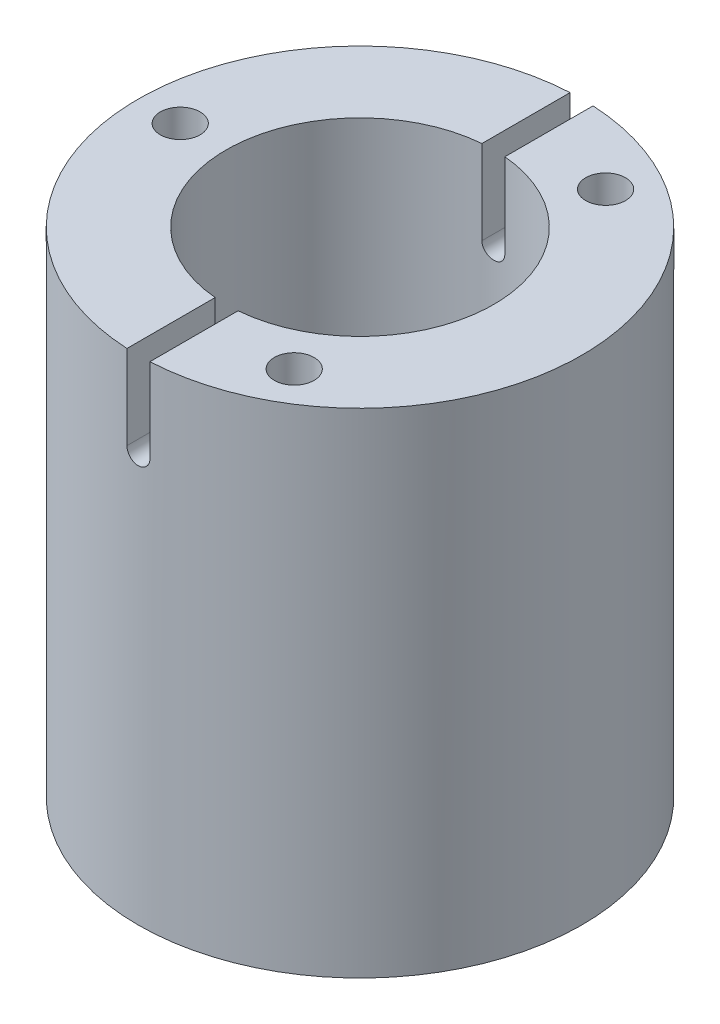
ISO-10303-21;
HEADER;
FILE_DESCRIPTION(('STEP AP214'),'2;1');
FILE_NAME('part.step','',(''),(''),'','','');
FILE_SCHEMA(('AUTOMOTIVE_DESIGN { 1 0 10303 214 1 1 1 1 }'));
ENDSEC;
DATA;
#1=APPLICATION_CONTEXT('core data for automotive mechanical design processes');
#2=APPLICATION_PROTOCOL_DEFINITION('international standard','automotive_design',2000,#1);
#3=PRODUCT_CONTEXT('',#1,'mechanical');
#4=PRODUCT('Part','Part','',(#3));
#5=PRODUCT_RELATED_PRODUCT_CATEGORY('part','',(#4));
#6=PRODUCT_DEFINITION_FORMATION('','',#4);
#7=PRODUCT_DEFINITION_CONTEXT('part definition',#1,'design');
#8=PRODUCT_DEFINITION('design','',#6,#7);
#9=PRODUCT_DEFINITION_SHAPE('','',#8);
#10=(LENGTH_UNIT() NAMED_UNIT(*) SI_UNIT(.MILLI.,.METRE.));
#11=(NAMED_UNIT(*) PLANE_ANGLE_UNIT() SI_UNIT($,.RADIAN.));
#12=(NAMED_UNIT(*) SI_UNIT($,.STERADIAN.) SOLID_ANGLE_UNIT());
#13=UNCERTAINTY_MEASURE_WITH_UNIT(LENGTH_MEASURE(1.E-05),#10,'distance_accuracy_value','');
#14=(GEOMETRIC_REPRESENTATION_CONTEXT(3) GLOBAL_UNCERTAINTY_ASSIGNED_CONTEXT((#13)) GLOBAL_UNIT_ASSIGNED_CONTEXT((#10,
#11,#12)) REPRESENTATION_CONTEXT('',''));
#15=CARTESIAN_POINT('',(0.,0.,0.));
#16=DIRECTION('',(0.,0.,1.));
#17=DIRECTION('',(1.,0.,0.));
#18=AXIS2_PLACEMENT_3D('',#15,#16,#17);
#19=CARTESIAN_POINT('',(0.,64.5,0.));
#20=DIRECTION('',(0.,1.,0.));
#21=DIRECTION('',(0.,0.,1.));
#22=AXIS2_PLACEMENT_3D('',#19,#20,#21);
#23=PLANE('',#22);
#24=CARTESIAN_POINT('',(-23.5,64.5,0.));
#25=DIRECTION('',(0.,1.,0.));
#26=DIRECTION('',(0.,0.,1.));
#27=AXIS2_PLACEMENT_3D('',#24,#25,#26);
#28=CIRCLE('',#27,2.59999999999998);
#29=CARTESIAN_POINT('',(-23.5,64.5,2.59999999999998));
#30=VERTEX_POINT('',#29);
#31=EDGE_CURVE('E280',#30,#30,#28,.T.);
#32=ORIENTED_EDGE('',*,*,#31,.F.);
#33=EDGE_LOOP('',(#32));
#34=FACE_BOUND('',#33,.T.);
#35=DIRECTION('',(0.,0.,1.));
#36=VECTOR('',#35,1.);
#37=CARTESIAN_POINT('',(-1.5,64.5,-29.));
#38=LINE('',#37,#36);
#39=CARTESIAN_POINT('',(-1.5,64.5,-28.9611809151492));
#40=VERTEX_POINT('',#39);
#41=CARTESIAN_POINT('',(-1.5,64.5,-17.4355957741627));
#42=VERTEX_POINT('',#41);
#43=EDGE_CURVE('E297',#40,#42,#38,.T.);
#44=ORIENTED_EDGE('',*,*,#43,.F.);
#45=CARTESIAN_POINT('',(0.,64.5,0.));
#46=DIRECTION('',(0.,1.,0.));
#47=DIRECTION('',(0.,0.,1.));
#48=AXIS2_PLACEMENT_3D('',#45,#46,#47);
#49=CIRCLE('',#48,29.);
#50=CARTESIAN_POINT('',(-1.5,64.5,28.9611809151491));
#51=VERTEX_POINT('',#50);
#52=EDGE_CURVE('E144',#40,#51,#49,.T.);
#53=ORIENTED_EDGE('',*,*,#52,.T.);
#54=CARTESIAN_POINT('',(-1.5,64.5,17.4355957741627));
#55=VERTEX_POINT('',#54);
#56=EDGE_CURVE('E136',#55,#51,#38,.T.);
#57=ORIENTED_EDGE('',*,*,#56,.F.);
#58=CARTESIAN_POINT('',(0.,64.5,0.));
#59=DIRECTION('',(0.,1.,0.));
#60=DIRECTION('',(0.,0.,1.));
#61=AXIS2_PLACEMENT_3D('',#58,#59,#60);
#62=CIRCLE('',#61,17.5);
#63=EDGE_CURVE('E326',#42,#55,#62,.T.);
#64=ORIENTED_EDGE('',*,*,#63,.F.);
#65=EDGE_LOOP('',(#44,#53,#57,#64));
#66=FACE_BOUND('',#65,.T.);
#67=ADVANCED_FACE('F49',(#34,#66),#23,.T.);
#68=CARTESIAN_POINT('',(0.,64.5,0.));
#69=DIRECTION('',(0.,-1.,0.));
#70=DIRECTION('',(0.,0.,-1.));
#71=AXIS2_PLACEMENT_3D('',#68,#69,#70);
#72=CYLINDRICAL_SURFACE('',#71,29.);
#73=ORIENTED_EDGE('',*,*,#52,.F.);
#74=DIRECTION('',(0.,-1.,0.));
#75=VECTOR('',#74,1.);
#76=CARTESIAN_POINT('',(-1.5,64.5,-28.9611809151492));
#77=LINE('',#76,#75);
#78=CARTESIAN_POINT('',(-1.5,53.5,-28.9611809151492));
#79=VERTEX_POINT('',#78);
#80=EDGE_CURVE('E222',#40,#79,#77,.T.);
#81=ORIENTED_EDGE('',*,*,#80,.T.);
#82=CARTESIAN_POINT('',(-1.5,53.5,-28.9611809151492));
#83=CARTESIAN_POINT('',(-1.49999975343445,53.4578289621925,-28.9611803965226));
#84=CARTESIAN_POINT('',(-1.49822048740297,53.4156781557056,-28.9612731418999));
#85=CARTESIAN_POINT('',(-1.49112249090391,53.3316787009967,-28.9616396695376));
#86=CARTESIAN_POINT('',(-1.48580394741005,53.2898300369312,-28.9619134422348));
#87=CARTESIAN_POINT('',(-1.46459035244814,53.1652603299346,-28.9629968867198));
#88=CARTESIAN_POINT('',(-1.4434371944517,53.083374611579,-28.9640687203741));
#89=CARTESIAN_POINT('',(-1.38770080282482,52.9243262145145,-28.9667922919744));
#90=CARTESIAN_POINT('',(-1.35311165240054,52.8471656339636,-28.9684442853738));
#91=CARTESIAN_POINT('',(-1.27149132851173,52.6997482728286,-28.972141311558));
#92=CARTESIAN_POINT('',(-1.22446234594386,52.6294902795497,-28.9741862751157));
#93=CARTESIAN_POINT('',(-1.11924758653608,52.4978047890233,-28.9784411350339));
#94=CARTESIAN_POINT('',(-1.06105229982171,52.436384897408,-28.9806511709926));
#95=CARTESIAN_POINT('',(-0.935167846555096,52.3241720630813,-28.9849861077017));
#96=CARTESIAN_POINT('',(-0.867477236387541,52.2733807392086,-28.9871109954432));
#97=CARTESIAN_POINT('',(-0.724486409308479,52.1838546722451,-28.9910370583197));
#98=CARTESIAN_POINT('',(-0.649182268053077,52.1451261892651,-28.9928380651699));
#99=CARTESIAN_POINT('',(-0.493134452846685,52.080867230136,-28.9959118136822));
#100=CARTESIAN_POINT('',(-0.412391157120094,52.0553358373648,-28.997184592032));
#101=CARTESIAN_POINT('',(-0.247828580284303,52.0182141111384,-28.9990576130463));
#102=CARTESIAN_POINT('',(-0.164012085525462,52.0066114561165,-28.9996584500877));
#103=CARTESIAN_POINT('',(0.00438298038570689,51.9976384627199,-29.0001218818135));
#104=CARTESIAN_POINT('',(0.0889615640211565,52.0002683579009,-28.9999844643831));
#105=CARTESIAN_POINT('',(0.256391797053009,52.0196760952262,-28.9989873459722));
#106=CARTESIAN_POINT('',(0.339245037024562,52.0364402563974,-28.998128343438));
#107=CARTESIAN_POINT('',(0.500959446608846,52.0836193925394,-28.9957856167906));
#108=CARTESIAN_POINT('',(0.579820616330908,52.1140343671364,-28.9943018926944));
#109=CARTESIAN_POINT('',(0.731358264991397,52.1876680319466,-28.9908756094009));
#110=CARTESIAN_POINT('',(0.804031581275861,52.2308932195766,-28.9889328174633));
#111=CARTESIAN_POINT('',(0.941092138527821,52.3289135088566,-28.9848073000043));
#112=CARTESIAN_POINT('',(1.00547971180871,52.3837081462618,-28.982624584112));
#113=CARTESIAN_POINT('',(1.12421618742752,52.5033802640808,-28.9782621879011));
#114=CARTESIAN_POINT('',(1.17855459852061,52.5682681531431,-28.9760825130865));
#115=CARTESIAN_POINT('',(1.2755856593789,52.7062766622863,-28.9719734991761));
#116=CARTESIAN_POINT('',(1.31827464857891,52.7793998599518,-28.9700442388671));
#117=CARTESIAN_POINT('',(1.39079221863855,52.9318190419544,-28.9666536021084));
#118=CARTESIAN_POINT('',(1.42061256537536,53.0111189403224,-28.9651925253838));
#119=CARTESIAN_POINT('',(1.46646760269076,53.1735479021921,-28.9629074621245));
#120=CARTESIAN_POINT('',(1.48252329145999,53.2566709285907,-28.9620825053732));
#121=CARTESIAN_POINT('',(1.49432811684235,53.3669618246927,-28.961474167214));
#122=CARTESIAN_POINT('',(1.49645618026441,53.3935482737203,-28.9613642570051));
#123=CARTESIAN_POINT('',(1.49929018465823,53.4467528649445,-28.9612177272304));
#124=CARTESIAN_POINT('',(1.49999847933285,53.4733708813669,-28.9611809863645));
#125=CARTESIAN_POINT('',(1.5,53.5,-28.9611809151492));
#126=B_SPLINE_CURVE_WITH_KNOTS('',3,(#82,#83,#84,#85,#86,#87,#88,#89,#90,#91,#92,#93,#94,#95,
#96,#97,#98,#99,#100,#101,#102,#103,#104,#105,#106,#107,#108,#109,#110,#111,#112,#113,#114,#115,
#116,#117,#118,#119,#120,#121,#122,#123,#124,#125),.UNSPECIFIED.,.F.,.F.,(4,2,2,2,2,2,2,2,2,2,2,
2,2,2,2,2,2,2,2,2,2,4),(0.,0.12643531806176,0.252863957301185,0.505303741889262,
0.757854819376485,1.01036144728246,1.26308408677872,1.51584519052414,1.76873724901524,
2.02161174017903,2.27426236961191,2.52691714504812,2.77932764885073,3.03173814574054,
3.2842768864946,3.53680549560699,3.78959627237235,4.04246639164712,4.29549807321582,
4.54814306080847,4.62813149108243,4.70798720592428),.UNSPECIFIED.);
#127=CARTESIAN_POINT('',(1.5,53.5,-28.9611809151492));
#128=VERTEX_POINT('',#127);
#129=EDGE_CURVE('E124',#79,#128,#126,.T.);
#130=ORIENTED_EDGE('',*,*,#129,.T.);
#131=DIRECTION('',(0.,-1.,0.));
#132=VECTOR('',#131,1.);
#133=CARTESIAN_POINT('',(1.5,64.5,-28.9611809151492));
#134=LINE('',#133,#132);
#135=CARTESIAN_POINT('',(1.5,64.5,-28.9611809151492));
#136=VERTEX_POINT('',#135);
#137=EDGE_CURVE('E116',#128,#136,#134,.F.);
#138=ORIENTED_EDGE('',*,*,#137,.T.);
#139=CARTESIAN_POINT('',(1.5,64.5,28.9611809151491));
#140=VERTEX_POINT('',#139);
#141=EDGE_CURVE('E122',#140,#136,#49,.T.);
#142=ORIENTED_EDGE('',*,*,#141,.F.);
#143=DIRECTION('',(0.,-1.,0.));
#144=VECTOR('',#143,1.);
#145=CARTESIAN_POINT('',(1.5,64.5,28.9611809151492));
#146=LINE('',#145,#144);
#147=CARTESIAN_POINT('',(1.5,53.5,28.9611809151492));
#148=VERTEX_POINT('',#147);
#149=EDGE_CURVE('E68',#140,#148,#146,.T.);
#150=ORIENTED_EDGE('',*,*,#149,.T.);
#151=CARTESIAN_POINT('',(1.5,53.5,28.9611809151492));
#152=CARTESIAN_POINT('',(1.49999975343445,53.4578289621925,28.9611803965226));
#153=CARTESIAN_POINT('',(1.49822048740297,53.4156781557056,28.9612731418999));
#154=CARTESIAN_POINT('',(1.49112249090391,53.3316787009967,28.9616396695376));
#155=CARTESIAN_POINT('',(1.48580394741005,53.2898300369312,28.9619134422348));
#156=CARTESIAN_POINT('',(1.46459035244814,53.1652603299346,28.9629968867198));
#157=CARTESIAN_POINT('',(1.4434371944517,53.083374611579,28.9640687203741));
#158=CARTESIAN_POINT('',(1.38770080282482,52.9243262145145,28.9667922919744));
#159=CARTESIAN_POINT('',(1.35311165240054,52.8471656339636,28.9684442853738));
#160=CARTESIAN_POINT('',(1.27149132851173,52.6997482728286,28.972141311558));
#161=CARTESIAN_POINT('',(1.22446234594386,52.6294902795497,28.9741862751157));
#162=CARTESIAN_POINT('',(1.11924758653608,52.4978047890233,28.9784411350339));
#163=CARTESIAN_POINT('',(1.06105229982171,52.436384897408,28.9806511709926));
#164=CARTESIAN_POINT('',(0.935167846555098,52.3241720630813,28.9849861077017));
#165=CARTESIAN_POINT('',(0.867477236387545,52.2733807392086,28.9871109954432));
#166=CARTESIAN_POINT('',(0.724486409308483,52.183854672245,28.9910370583197));
#167=CARTESIAN_POINT('',(0.64918226805308,52.1451261892651,28.9928380651699));
#168=CARTESIAN_POINT('',(0.493134452846686,52.080867230136,28.9959118136822));
#169=CARTESIAN_POINT('',(0.412391157120094,52.0553358373648,28.997184592032));
#170=CARTESIAN_POINT('',(0.247828580284302,52.0182141111384,28.9990576130463));
#171=CARTESIAN_POINT('',(0.16401208552546,52.0066114561165,28.9996584500877));
#172=CARTESIAN_POINT('',(-0.00438298038570772,51.9976384627199,29.0001218818135));
#173=CARTESIAN_POINT('',(-0.0889615640211571,52.0002683579009,28.9999844643831));
#174=CARTESIAN_POINT('',(-0.25639179705301,52.0196760952262,28.9989873459722));
#175=CARTESIAN_POINT('',(-0.339245037024562,52.0364402563974,28.998128343438));
#176=CARTESIAN_POINT('',(-0.500959446608846,52.0836193925394,28.9957856167906));
#177=CARTESIAN_POINT('',(-0.579820616330908,52.1140343671364,28.9943018926944));
#178=CARTESIAN_POINT('',(-0.731358264991397,52.1876680319466,28.9908756094009));
#179=CARTESIAN_POINT('',(-0.804031581275861,52.2308932195766,28.9889328174633));
#180=CARTESIAN_POINT('',(-0.941092138527821,52.3289135088566,28.9848073000043));
#181=CARTESIAN_POINT('',(-1.00547971180871,52.3837081462618,28.982624584112));
#182=CARTESIAN_POINT('',(-1.12421618742752,52.5033802640808,28.9782621879011));
#183=CARTESIAN_POINT('',(-1.17855459852061,52.5682681531431,28.9760825130865));
#184=CARTESIAN_POINT('',(-1.2755856593789,52.7062766622863,28.9719734991761));
#185=CARTESIAN_POINT('',(-1.31827464857891,52.7793998599518,28.9700442388671));
#186=CARTESIAN_POINT('',(-1.39079221863855,52.9318190419544,28.9666536021084));
#187=CARTESIAN_POINT('',(-1.42061256537536,53.0111189403224,28.9651925253838));
#188=CARTESIAN_POINT('',(-1.46646760269076,53.1735479021921,28.9629074621245));
#189=CARTESIAN_POINT('',(-1.48252329145999,53.2566709285907,28.9620825053732));
#190=CARTESIAN_POINT('',(-1.49432811684235,53.3669618246927,28.961474167214));
#191=CARTESIAN_POINT('',(-1.49645618026441,53.3935482737203,28.9613642570051));
#192=CARTESIAN_POINT('',(-1.49929018465823,53.4467528649445,28.9612177272304));
#193=CARTESIAN_POINT('',(-1.49999847933285,53.4733708813669,28.9611809863645));
#194=CARTESIAN_POINT('',(-1.5,53.5,28.9611809151492));
#195=B_SPLINE_CURVE_WITH_KNOTS('',3,(#151,#152,#153,#154,#155,#156,#157,#158,#159,#160,#161,
#162,#163,#164,#165,#166,#167,#168,#169,#170,#171,#172,#173,#174,#175,#176,#177,#178,#179,#180,
#181,#182,#183,#184,#185,#186,#187,#188,#189,#190,#191,#192,#193,#194),.UNSPECIFIED.,.F.,.F.,(4,
2,2,2,2,2,2,2,2,2,2,2,2,2,2,2,2,2,2,2,2,4),(0.,0.12643531806176,0.252863957301185,
0.505303741889262,0.757854819376485,1.01036144728246,1.26308408677872,1.51584519052414,
1.76873724901524,2.02161174017903,2.27426236961192,2.52691714504812,2.77932764885073,
3.03173814574054,3.2842768864946,3.53680549560699,3.78959627237235,4.04246639164712,
4.29549807321582,4.54814306080847,4.62813149108243,4.70798720592428),.UNSPECIFIED.);
#196=CARTESIAN_POINT('',(-1.5,53.5,28.9611809151491));
#197=VERTEX_POINT('',#196);
#198=EDGE_CURVE('E221',#148,#197,#195,.T.);
#199=ORIENTED_EDGE('',*,*,#198,.T.);
#200=DIRECTION('',(0.,-1.,0.));
#201=VECTOR('',#200,1.);
#202=CARTESIAN_POINT('',(-1.5,64.5,28.9611809151492));
#203=LINE('',#202,#201);
#204=EDGE_CURVE('E308',#197,#51,#203,.F.);
#205=ORIENTED_EDGE('',*,*,#204,.T.);
#206=EDGE_LOOP('',(#73,#81,#130,#138,#142,#150,#199,#205));
#207=FACE_BOUND('',#206,.T.);
#208=CARTESIAN_POINT('',(0.,0.,0.));
#209=DIRECTION('',(0.,1.,0.));
#210=DIRECTION('',(0.,0.,1.));
#211=AXIS2_PLACEMENT_3D('',#208,#209,#210);
#212=CIRCLE('',#211,29.);
#213=CARTESIAN_POINT('',(0.,0.,29.));
#214=VERTEX_POINT('',#213);
#215=EDGE_CURVE('E152',#214,#214,#212,.T.);
#216=ORIENTED_EDGE('',*,*,#215,.T.);
#217=EDGE_LOOP('',(#216));
#218=FACE_BOUND('',#217,.T.);
#219=ADVANCED_FACE('F119',(#207,#218),#72,.T.);
#220=CARTESIAN_POINT('',(11.7500000000001,64.5,20.3515969889343));
#221=DIRECTION('',(0.,1.,0.));
#222=DIRECTION('',(0.,0.,1.));
#223=AXIS2_PLACEMENT_3D('',#220,#221,#222);
#224=CIRCLE('',#223,2.59999999999998);
#225=CARTESIAN_POINT('',(11.7500000000001,64.5,22.9515969889342));
#226=VERTEX_POINT('',#225);
#227=EDGE_CURVE('E54',#226,#226,#224,.T.);
#228=ORIENTED_EDGE('',*,*,#227,.F.);
#229=EDGE_LOOP('',(#228));
#230=FACE_BOUND('',#229,.T.);
#231=CARTESIAN_POINT('',(11.7500000000001,64.5,-20.3515969889343));
#232=DIRECTION('',(0.,1.,0.));
#233=DIRECTION('',(0.,0.,1.));
#234=AXIS2_PLACEMENT_3D('',#231,#232,#233);
#235=CIRCLE('',#234,2.59999999999998);
#236=CARTESIAN_POINT('',(11.7500000000001,64.5,-17.7515969889343));
#237=VERTEX_POINT('',#236);
#238=EDGE_CURVE('E267',#237,#237,#235,.T.);
#239=ORIENTED_EDGE('',*,*,#238,.F.);
#240=EDGE_LOOP('',(#239));
#241=FACE_BOUND('',#240,.T.);
#242=DIRECTION('',(0.,0.,1.));
#243=VECTOR('',#242,1.);
#244=CARTESIAN_POINT('',(1.5,64.5,-29.));
#245=LINE('',#244,#243);
#246=CARTESIAN_POINT('',(1.5,64.5,17.4355957741627));
#247=VERTEX_POINT('',#246);
#248=EDGE_CURVE('E137',#247,#140,#245,.T.);
#249=ORIENTED_EDGE('',*,*,#248,.T.);
#250=ORIENTED_EDGE('',*,*,#141,.T.);
#251=CARTESIAN_POINT('',(1.5,64.5,-17.4355957741627));
#252=VERTEX_POINT('',#251);
#253=EDGE_CURVE('E131',#136,#252,#245,.T.);
#254=ORIENTED_EDGE('',*,*,#253,.T.);
#255=EDGE_CURVE('E155',#247,#252,#62,.T.);
#256=ORIENTED_EDGE('',*,*,#255,.F.);
#257=EDGE_LOOP('',(#249,#250,#254,#256));
#258=FACE_BOUND('',#257,.T.);
#259=ADVANCED_FACE('F140',(#230,#241,#258),#23,.T.);
#260=CARTESIAN_POINT('',(0.,0.,0.));
#261=DIRECTION('',(0.,1.,0.));
#262=DIRECTION('',(0.,0.,1.));
#263=AXIS2_PLACEMENT_3D('',#260,#261,#262);
#264=PLANE('',#263);
#265=CARTESIAN_POINT('',(11.7500000000001,0.,20.3515969889343));
#266=DIRECTION('',(0.,-1.,0.));
#267=DIRECTION('',(0.,0.,-1.));
#268=AXIS2_PLACEMENT_3D('',#265,#266,#267);
#269=CIRCLE('',#268,4.49999999999999);
#270=CARTESIAN_POINT('',(11.7500000000001,0.,15.8515969889343));
#271=VERTEX_POINT('',#270);
#272=EDGE_CURVE('E390',#271,#271,#269,.T.);
#273=ORIENTED_EDGE('',*,*,#272,.F.);
#274=EDGE_LOOP('',(#273));
#275=FACE_BOUND('',#274,.T.);
#276=CARTESIAN_POINT('',(11.7500000000001,0.,-20.3515969889343));
#277=DIRECTION('',(0.,-1.,0.));
#278=DIRECTION('',(0.,0.,-1.));
#279=AXIS2_PLACEMENT_3D('',#276,#277,#278);
#280=CIRCLE('',#279,4.49999999999999);
#281=CARTESIAN_POINT('',(11.7500000000001,0.,-24.8515969889342));
#282=VERTEX_POINT('',#281);
#283=EDGE_CURVE('E400',#282,#282,#280,.T.);
#284=ORIENTED_EDGE('',*,*,#283,.F.);
#285=EDGE_LOOP('',(#284));
#286=FACE_BOUND('',#285,.T.);
#287=CARTESIAN_POINT('',(-23.5,0.,0.));
#288=DIRECTION('',(0.,-1.,0.));
#289=DIRECTION('',(0.,0.,-1.));
#290=AXIS2_PLACEMENT_3D('',#287,#288,#289);
#291=CIRCLE('',#290,4.49999999999999);
#292=CARTESIAN_POINT('',(-23.5,0.,-4.49999999999999));
#293=VERTEX_POINT('',#292);
#294=EDGE_CURVE('E270',#293,#293,#291,.T.);
#295=ORIENTED_EDGE('',*,*,#294,.F.);
#296=EDGE_LOOP('',(#295));
#297=FACE_BOUND('',#296,.T.);
#298=CARTESIAN_POINT('',(0.,0.,0.));
#299=DIRECTION('',(0.,1.,0.));
#300=DIRECTION('',(0.,0.,1.));
#301=AXIS2_PLACEMENT_3D('',#298,#299,#300);
#302=CIRCLE('',#301,2.99999999999999);
#303=CARTESIAN_POINT('',(0.,0.,2.99999999999999));
#304=VERTEX_POINT('',#303);
#305=EDGE_CURVE('E149',#304,#304,#302,.T.);
#306=ORIENTED_EDGE('',*,*,#305,.T.);
#307=EDGE_LOOP('',(#306));
#308=FACE_BOUND('',#307,.T.);
#309=ORIENTED_EDGE('',*,*,#215,.F.);
#310=EDGE_LOOP('',(#309));
#311=FACE_BOUND('',#310,.T.);
#312=ADVANCED_FACE('F231',(#275,#286,#297,#308,#311),#264,.F.);
#313=CARTESIAN_POINT('',(0.,5.,0.));
#314=DIRECTION('',(0.,1.,0.));
#315=DIRECTION('',(0.,0.,1.));
#316=AXIS2_PLACEMENT_3D('',#313,#314,#315);
#317=CYLINDRICAL_SURFACE('',#316,17.5);
#318=ORIENTED_EDGE('',*,*,#63,.T.);
#319=DIRECTION('',(0.,1.,0.));
#320=VECTOR('',#319,1.);
#321=CARTESIAN_POINT('',(-1.49999999999999,5.,17.4355957741627));
#322=LINE('',#321,#320);
#323=CARTESIAN_POINT('',(-1.5,53.5,17.4355957741627));
#324=VERTEX_POINT('',#323);
#325=EDGE_CURVE('E175',#55,#324,#322,.F.);
#326=ORIENTED_EDGE('',*,*,#325,.T.);
#327=CARTESIAN_POINT('',(-1.5,53.5,17.4355957741627));
#328=CARTESIAN_POINT('',(-1.49999981215615,53.4578813584865,17.4355949074219));
#329=CARTESIAN_POINT('',(-1.49822490516126,53.4157829710547,17.4357485858031));
#330=CARTESIAN_POINT('',(-1.49114468390479,53.3318889493543,17.4363558741141));
#331=CARTESIAN_POINT('',(-1.48583958676992,53.2900932966256,17.4368094655975));
#332=CARTESIAN_POINT('',(-1.46468188406346,53.1656909642501,17.4386043105873));
#333=CARTESIAN_POINT('',(-1.4435867129681,53.0839200086461,17.440379697278));
#334=CARTESIAN_POINT('',(-1.38801321048827,52.925099727835,17.4448900002009));
#335=CARTESIAN_POINT('',(-1.35352952866977,52.8480523045587,17.4476252999999));
#336=CARTESIAN_POINT('',(-1.27216675702686,52.7008381142733,17.4537460074193));
#337=CARTESIAN_POINT('',(-1.22528940984768,52.6306703818265,17.457131323624));
#338=CARTESIAN_POINT('',(-1.12033970213837,52.4990290771668,17.4641805653109));
#339=CARTESIAN_POINT('',(-1.06224170389698,52.4375759853722,17.4678451169718));
#340=CARTESIAN_POINT('',(-0.9365463676528,52.3252726462456,17.4750346476224));
#341=CARTESIAN_POINT('',(-0.868947585875256,52.2744240133295,17.4785596052942));
#342=CARTESIAN_POINT('',(-0.726048901641291,52.1847127041021,17.4850784518751));
#343=CARTESIAN_POINT('',(-0.650737542940758,52.1458682128677,17.4880715321564));
#344=CARTESIAN_POINT('',(-0.4946361593512,52.0813860212554,17.493182291645));
#345=CARTESIAN_POINT('',(-0.413846568231144,52.055747276619,17.4953000400674));
#346=CARTESIAN_POINT('',(-0.249288540611533,52.0184619122463,17.4984172801289));
#347=CARTESIAN_POINT('',(-0.165527915546372,52.0067810493453,17.4994195080816));
#348=CARTESIAN_POINT('',(0.00277267826799206,51.9976370818457,17.5002020717693));
#349=CARTESIAN_POINT('',(0.0873126508842909,52.0001740478334,17.499982401438));
#350=CARTESIAN_POINT('',(0.254535298416798,52.0193662514608,17.4983481303948));
#351=CARTESIAN_POINT('',(0.337222281887321,52.0359842542744,17.4969366811671));
#352=CARTESIAN_POINT('',(0.498628631482817,52.0828088370465,17.4930812275363));
#353=CARTESIAN_POINT('',(0.577347977045443,52.1130154874203,17.4906372177825));
#354=CARTESIAN_POINT('',(0.728704745377913,52.1862019779826,17.484986097806));
#355=CARTESIAN_POINT('',(0.801333952660874,52.2291987274234,17.4817779785122));
#356=CARTESIAN_POINT('',(0.938355362533658,52.3267306748645,17.474959299036));
#357=CARTESIAN_POINT('',(1.00274776477319,52.3812655931093,17.4713487486118));
#358=CARTESIAN_POINT('',(1.12168076616879,52.5005267949595,17.4641175213755));
#359=CARTESIAN_POINT('',(1.17619036050114,52.5652839991121,17.4604968476847));
#360=CARTESIAN_POINT('',(1.27358672033536,52.7030716223852,17.4536634924953));
#361=CARTESIAN_POINT('',(1.31646990966058,52.7761045772789,17.4504509366911));
#362=CARTESIAN_POINT('',(1.38939356755706,52.9284021366744,17.4447966315883));
#363=CARTESIAN_POINT('',(1.41942463040815,53.0076712550069,17.442355447152));
#364=CARTESIAN_POINT('',(1.46569712121356,53.1700924449613,17.4385286090553));
#365=CARTESIAN_POINT('',(1.48195945832216,53.2532384258436,17.4371413552286));
#366=CARTESIAN_POINT('',(1.49408381096928,53.3641322108555,17.4361038255458));
#367=CARTESIAN_POINT('',(1.49630350347403,53.3912820214994,17.4359134202937));
#368=CARTESIAN_POINT('',(1.49925958815967,53.4456174767558,17.4356595549642));
#369=CARTESIAN_POINT('',(1.49999844884364,53.4728029860146,17.4355958836263));
#370=CARTESIAN_POINT('',(1.5,53.5,17.4355957741627));
#371=B_SPLINE_CURVE_WITH_KNOTS('',3,(#327,#328,#329,#330,#331,#332,#333,#334,#335,#336,#337,
#338,#339,#340,#341,#342,#343,#344,#345,#346,#347,#348,#349,#350,#351,#352,#353,#354,#355,#356,
#357,#358,#359,#360,#361,#362,#363,#364,#365,#366,#367,#368,#369,#370),.UNSPECIFIED.,.F.,.F.,(4,
2,2,2,2,2,2,2,2,2,2,2,2,2,2,2,2,2,2,2,2,4),(0.,0.126278071518776,0.252548376938123,
0.504647984426749,0.756848442040234,1.00901345716016,1.26176160219659,1.51454819740272,
1.76771588278891,2.02086354559604,2.273388872409,2.52591545291941,2.7777763477388,
3.0296385476971,3.28183521526161,3.53402576874006,3.78699430975708,4.04004057354948,
4.29327171173339,4.54611760041726,4.62781183196962,4.70936976799501),.UNSPECIFIED.);
#372=CARTESIAN_POINT('',(1.5,53.5,17.4355957741627));
#373=VERTEX_POINT('',#372);
#374=EDGE_CURVE('E178',#324,#373,#371,.T.);
#375=ORIENTED_EDGE('',*,*,#374,.T.);
#376=DIRECTION('',(0.,1.,0.));
#377=VECTOR('',#376,1.);
#378=CARTESIAN_POINT('',(1.50000000000001,5.,17.4355957741627));
#379=LINE('',#378,#377);
#380=EDGE_CURVE('E172',#373,#247,#379,.T.);
#381=ORIENTED_EDGE('',*,*,#380,.T.);
#382=ORIENTED_EDGE('',*,*,#255,.T.);
#383=DIRECTION('',(0.,1.,0.));
#384=VECTOR('',#383,1.);
#385=CARTESIAN_POINT('',(1.50000000000001,5.,-17.4355957741627));
#386=LINE('',#385,#384);
#387=CARTESIAN_POINT('',(1.50000000000001,53.5,-17.4355957741627));
#388=VERTEX_POINT('',#387);
#389=EDGE_CURVE('E75',#252,#388,#386,.F.);
#390=ORIENTED_EDGE('',*,*,#389,.T.);
#391=CARTESIAN_POINT('',(1.5,53.5,-17.4355957741627));
#392=CARTESIAN_POINT('',(1.49999981215615,53.4578813584865,-17.4355949074219));
#393=CARTESIAN_POINT('',(1.49822490516126,53.4157829710547,-17.4357485858031));
#394=CARTESIAN_POINT('',(1.49114468390479,53.3318889493543,-17.4363558741141));
#395=CARTESIAN_POINT('',(1.48583958676992,53.2900932966256,-17.4368094655975));
#396=CARTESIAN_POINT('',(1.46468188406346,53.1656909642501,-17.4386043105873));
#397=CARTESIAN_POINT('',(1.4435867129681,53.0839200086461,-17.440379697278));
#398=CARTESIAN_POINT('',(1.38801321048827,52.925099727835,-17.4448900002009));
#399=CARTESIAN_POINT('',(1.35352952866977,52.8480523045587,-17.4476252999999));
#400=CARTESIAN_POINT('',(1.27216675702686,52.7008381142733,-17.4537460074193));
#401=CARTESIAN_POINT('',(1.22528940984768,52.6306703818265,-17.457131323624));
#402=CARTESIAN_POINT('',(1.12033970213837,52.4990290771668,-17.4641805653109));
#403=CARTESIAN_POINT('',(1.06224170389698,52.4375759853722,-17.4678451169718));
#404=CARTESIAN_POINT('',(0.9365463676528,52.3252726462456,-17.4750346476224));
#405=CARTESIAN_POINT('',(0.868947585875256,52.2744240133295,-17.4785596052942));
#406=CARTESIAN_POINT('',(0.726048901641291,52.1847127041021,-17.4850784518751));
#407=CARTESIAN_POINT('',(0.650737542940758,52.1458682128677,-17.4880715321564));
#408=CARTESIAN_POINT('',(0.4946361593512,52.0813860212554,-17.493182291645));
#409=CARTESIAN_POINT('',(0.413846568231144,52.055747276619,-17.4953000400674));
#410=CARTESIAN_POINT('',(0.249288540611533,52.0184619122463,-17.4984172801289));
#411=CARTESIAN_POINT('',(0.165527915546371,52.0067810493453,-17.4994195080816));
#412=CARTESIAN_POINT('',(-0.00277267826799233,51.9976370818457,-17.5002020717693));
#413=CARTESIAN_POINT('',(-0.087312650884291,52.0001740478334,-17.499982401438));
#414=CARTESIAN_POINT('',(-0.254535298416798,52.0193662514608,-17.4983481303948));
#415=CARTESIAN_POINT('',(-0.337222281887321,52.0359842542744,-17.4969366811671));
#416=CARTESIAN_POINT('',(-0.498628631482817,52.0828088370465,-17.4930812275363));
#417=CARTESIAN_POINT('',(-0.577347977045442,52.1130154874203,-17.4906372177825));
#418=CARTESIAN_POINT('',(-0.728704745377912,52.1862019779826,-17.484986097806));
#419=CARTESIAN_POINT('',(-0.801333952660873,52.2291987274234,-17.4817779785122));
#420=CARTESIAN_POINT('',(-0.938355362533658,52.3267306748645,-17.474959299036));
#421=CARTESIAN_POINT('',(-1.00274776477319,52.3812655931093,-17.4713487486118));
#422=CARTESIAN_POINT('',(-1.12168076616879,52.5005267949595,-17.4641175213755));
#423=CARTESIAN_POINT('',(-1.17619036050114,52.5652839991121,-17.4604968476847));
#424=CARTESIAN_POINT('',(-1.27358672033536,52.7030716223852,-17.4536634924953));
#425=CARTESIAN_POINT('',(-1.31646990966058,52.7761045772789,-17.4504509366911));
#426=CARTESIAN_POINT('',(-1.38939356755706,52.9284021366744,-17.4447966315883));
#427=CARTESIAN_POINT('',(-1.41942463040815,53.0076712550069,-17.442355447152));
#428=CARTESIAN_POINT('',(-1.46569712121356,53.1700924449613,-17.4385286090553));
#429=CARTESIAN_POINT('',(-1.48195945832216,53.2532384258436,-17.4371413552286));
#430=CARTESIAN_POINT('',(-1.49408381096928,53.3641322108555,-17.4361038255458));
#431=CARTESIAN_POINT('',(-1.49630350347403,53.3912820214994,-17.4359134202937));
#432=CARTESIAN_POINT('',(-1.49925958815967,53.4456174767558,-17.4356595549642));
#433=CARTESIAN_POINT('',(-1.49999844884364,53.4728029860146,-17.4355958836263));
#434=CARTESIAN_POINT('',(-1.5,53.5,-17.4355957741627));
#435=B_SPLINE_CURVE_WITH_KNOTS('',3,(#391,#392,#393,#394,#395,#396,#397,#398,#399,#400,#401,
#402,#403,#404,#405,#406,#407,#408,#409,#410,#411,#412,#413,#414,#415,#416,#417,#418,#419,#420,
#421,#422,#423,#424,#425,#426,#427,#428,#429,#430,#431,#432,#433,#434),.UNSPECIFIED.,.F.,.F.,(4,
2,2,2,2,2,2,2,2,2,2,2,2,2,2,2,2,2,2,2,2,4),(0.,0.126278071518776,0.252548376938123,
0.504647984426749,0.756848442040234,1.00901345716016,1.26176160219659,1.51454819740272,
1.76771588278891,2.02086354559604,2.27338887240901,2.52591545291941,2.7777763477388,
3.0296385476971,3.28183521526161,3.53402576874006,3.78699430975708,4.04004057354948,
4.29327171173339,4.54611760041726,4.62781183196963,4.70936976799501),.UNSPECIFIED.);
#436=CARTESIAN_POINT('',(-1.5,53.5,-17.4355957741627));
#437=VERTEX_POINT('',#436);
#438=EDGE_CURVE('E11',#388,#437,#435,.T.);
#439=ORIENTED_EDGE('',*,*,#438,.T.);
#440=DIRECTION('',(0.,1.,0.));
#441=VECTOR('',#440,1.);
#442=CARTESIAN_POINT('',(-1.49999999999999,5.,-17.4355957741627));
#443=LINE('',#442,#441);
#444=EDGE_CURVE('E60',#437,#42,#443,.T.);
#445=ORIENTED_EDGE('',*,*,#444,.T.);
#446=EDGE_LOOP('',(#318,#326,#375,#381,#382,#390,#439,#445));
#447=FACE_BOUND('',#446,.T.);
#448=CARTESIAN_POINT('',(0.,5.,0.));
#449=DIRECTION('',(0.,1.,0.));
#450=DIRECTION('',(0.,0.,1.));
#451=AXIS2_PLACEMENT_3D('',#448,#449,#450);
#452=CIRCLE('',#451,17.5);
#453=CARTESIAN_POINT('',(0.,5.,17.5));
#454=VERTEX_POINT('',#453);
#455=EDGE_CURVE('E159',#454,#454,#452,.T.);
#456=ORIENTED_EDGE('',*,*,#455,.F.);
#457=EDGE_LOOP('',(#456));
#458=FACE_BOUND('',#457,.T.);
#459=ADVANCED_FACE('F189',(#447,#458),#317,.F.);
#460=CARTESIAN_POINT('',(0.,5.,0.));
#461=DIRECTION('',(0.,1.,0.));
#462=DIRECTION('',(0.,0.,1.));
#463=AXIS2_PLACEMENT_3D('',#460,#461,#462);
#464=PLANE('',#463);
#465=CARTESIAN_POINT('',(0.,5.,0.));
#466=DIRECTION('',(0.,1.,0.));
#467=DIRECTION('',(0.,0.,1.));
#468=AXIS2_PLACEMENT_3D('',#465,#466,#467);
#469=CIRCLE('',#468,3.49999999999999);
#470=CARTESIAN_POINT('',(0.,5.,3.49999999999999));
#471=VERTEX_POINT('',#470);
#472=EDGE_CURVE('E168',#471,#471,#469,.F.);
#473=ORIENTED_EDGE('',*,*,#472,.T.);
#474=EDGE_LOOP('',(#473));
#475=FACE_BOUND('',#474,.T.);
#476=ORIENTED_EDGE('',*,*,#455,.T.);
#477=EDGE_LOOP('',(#476));
#478=FACE_BOUND('',#477,.T.);
#479=ADVANCED_FACE('F245',(#475,#478),#464,.T.);
#480=CARTESIAN_POINT('',(0.,0.,0.));
#481=DIRECTION('',(0.,-1.,0.));
#482=DIRECTION('',(0.,0.,-1.));
#483=AXIS2_PLACEMENT_3D('',#480,#481,#482);
#484=CYLINDRICAL_SURFACE('',#483,2.49999999999999);
#485=CARTESIAN_POINT('',(0.,4.00000000000001,0.));
#486=DIRECTION('',(0.,1.,0.));
#487=DIRECTION('',(0.,0.,1.));
#488=AXIS2_PLACEMENT_3D('',#485,#486,#487);
#489=CIRCLE('',#488,2.49999999999999);
#490=CARTESIAN_POINT('',(0.,4.00000000000001,2.49999999999999));
#491=VERTEX_POINT('',#490);
#492=EDGE_CURVE('E164',#491,#491,#489,.T.);
#493=ORIENTED_EDGE('',*,*,#492,.T.);
#494=EDGE_LOOP('',(#493));
#495=FACE_BOUND('',#494,.T.);
#496=CARTESIAN_POINT('',(0.,0.499999999999994,0.));
#497=DIRECTION('',(0.,1.,0.));
#498=DIRECTION('',(0.,0.,1.));
#499=AXIS2_PLACEMENT_3D('',#496,#497,#498);
#500=CIRCLE('',#499,2.49999999999999);
#501=CARTESIAN_POINT('',(0.,0.499999999999994,2.49999999999999));
#502=VERTEX_POINT('',#501);
#503=EDGE_CURVE('E143',#502,#502,#500,.F.);
#504=ORIENTED_EDGE('',*,*,#503,.T.);
#505=EDGE_LOOP('',(#504));
#506=FACE_BOUND('',#505,.T.);
#507=ADVANCED_FACE('F203',(#495,#506),#484,.F.);
#508=CARTESIAN_POINT('',(0.,0.499999999999994,0.));
#509=DIRECTION('',(0.,-1.,0.));
#510=DIRECTION('',(0.,0.,-1.));
#511=AXIS2_PLACEMENT_3D('',#508,#509,#510);
#512=CONICAL_SURFACE('',#511,2.49999999999999,0.785398163397453);
#513=ORIENTED_EDGE('',*,*,#305,.F.);
#514=EDGE_LOOP('',(#513));
#515=FACE_BOUND('',#514,.T.);
#516=ORIENTED_EDGE('',*,*,#503,.F.);
#517=EDGE_LOOP('',(#516));
#518=FACE_BOUND('',#517,.T.);
#519=ADVANCED_FACE('F233',(#515,#518),#512,.F.);
#520=CARTESIAN_POINT('',(0.,4.00000000000001,0.));
#521=DIRECTION('',(0.,1.,0.));
#522=DIRECTION('',(0.,0.,1.));
#523=AXIS2_PLACEMENT_3D('',#520,#521,#522);
#524=CONICAL_SURFACE('',#523,2.49999999999999,0.785398163397451);
#525=ORIENTED_EDGE('',*,*,#472,.F.);
#526=EDGE_LOOP('',(#525));
#527=FACE_BOUND('',#526,.T.);
#528=ORIENTED_EDGE('',*,*,#492,.F.);
#529=EDGE_LOOP('',(#528));
#530=FACE_BOUND('',#529,.T.);
#531=ADVANCED_FACE('F52',(#527,#530),#524,.F.);
#532=CARTESIAN_POINT('',(1.5,53.5,-29.));
#533=DIRECTION('',(1.,0.,0.));
#534=DIRECTION('',(0.,1.,0.));
#535=AXIS2_PLACEMENT_3D('',#532,#533,#534);
#536=PLANE('',#535);
#537=DIRECTION('',(0.,0.,1.));
#538=VECTOR('',#537,1.);
#539=CARTESIAN_POINT('',(1.5,53.5,-29.));
#540=LINE('',#539,#538);
#541=EDGE_CURVE('E304',#373,#148,#540,.T.);
#542=ORIENTED_EDGE('',*,*,#541,.T.);
#543=ORIENTED_EDGE('',*,*,#149,.F.);
#544=ORIENTED_EDGE('',*,*,#248,.F.);
#545=ORIENTED_EDGE('',*,*,#380,.F.);
#546=EDGE_LOOP('',(#542,#543,#544,#545));
#547=FACE_BOUND('',#546,.T.);
#548=ADVANCED_FACE('F201',(#547),#536,.F.);
#549=CARTESIAN_POINT('',(-1.5,53.5,-29.));
#550=DIRECTION('',(-1.,0.,0.));
#551=DIRECTION('',(0.,-1.,0.));
#552=AXIS2_PLACEMENT_3D('',#549,#550,#551);
#553=PLANE('',#552);
#554=DIRECTION('',(0.,0.,1.));
#555=VECTOR('',#554,1.);
#556=CARTESIAN_POINT('',(-1.5,53.5,-29.));
#557=LINE('',#556,#555);
#558=EDGE_CURVE('E299',#324,#197,#557,.T.);
#559=ORIENTED_EDGE('',*,*,#558,.F.);
#560=ORIENTED_EDGE('',*,*,#325,.F.);
#561=ORIENTED_EDGE('',*,*,#56,.T.);
#562=ORIENTED_EDGE('',*,*,#204,.F.);
#563=EDGE_LOOP('',(#559,#560,#561,#562));
#564=FACE_BOUND('',#563,.T.);
#565=ADVANCED_FACE('F199',(#564),#553,.F.);
#566=CARTESIAN_POINT('',(0.,53.5,-29.));
#567=DIRECTION('',(0.,0.,1.));
#568=DIRECTION('',(1.,0.,0.));
#569=AXIS2_PLACEMENT_3D('',#566,#567,#568);
#570=CYLINDRICAL_SURFACE('',#569,1.5);
#571=ORIENTED_EDGE('',*,*,#541,.F.);
#572=ORIENTED_EDGE('',*,*,#374,.F.);
#573=ORIENTED_EDGE('',*,*,#558,.T.);
#574=ORIENTED_EDGE('',*,*,#198,.F.);
#575=EDGE_LOOP('',(#571,#572,#573,#574));
#576=FACE_BOUND('',#575,.T.);
#577=ADVANCED_FACE('F193',(#576),#570,.F.);
#578=EDGE_CURVE('E128',#79,#437,#557,.T.);
#579=ORIENTED_EDGE('',*,*,#578,.T.);
#580=ORIENTED_EDGE('',*,*,#438,.F.);
#581=EDGE_CURVE('E303',#128,#388,#540,.T.);
#582=ORIENTED_EDGE('',*,*,#581,.F.);
#583=ORIENTED_EDGE('',*,*,#129,.F.);
#584=EDGE_LOOP('',(#579,#580,#582,#583));
#585=FACE_BOUND('',#584,.T.);
#586=ADVANCED_FACE('F198',(#585),#570,.F.);
#587=ORIENTED_EDGE('',*,*,#578,.F.);
#588=ORIENTED_EDGE('',*,*,#80,.F.);
#589=ORIENTED_EDGE('',*,*,#43,.T.);
#590=ORIENTED_EDGE('',*,*,#444,.F.);
#591=EDGE_LOOP('',(#587,#588,#589,#590));
#592=FACE_BOUND('',#591,.T.);
#593=ADVANCED_FACE('F319',(#592),#553,.F.);
#594=ORIENTED_EDGE('',*,*,#581,.T.);
#595=ORIENTED_EDGE('',*,*,#389,.F.);
#596=ORIENTED_EDGE('',*,*,#253,.F.);
#597=ORIENTED_EDGE('',*,*,#137,.F.);
#598=EDGE_LOOP('',(#594,#595,#596,#597));
#599=FACE_BOUND('',#598,.T.);
#600=ADVANCED_FACE('F132',(#599),#536,.F.);
#601=CARTESIAN_POINT('',(-23.5,0.,0.));
#602=DIRECTION('',(0.,-1.,0.));
#603=DIRECTION('',(0.,0.,-1.));
#604=AXIS2_PLACEMENT_3D('',#601,#602,#603);
#605=CYLINDRICAL_SURFACE('',#604,2.59999999999998);
#606=ORIENTED_EDGE('',*,*,#31,.T.);
#607=EDGE_LOOP('',(#606));
#608=FACE_BOUND('',#607,.T.);
#609=CARTESIAN_POINT('',(-23.5,6.00000000000001,0.));
#610=DIRECTION('',(0.,-1.,0.));
#611=DIRECTION('',(0.,0.,-1.));
#612=AXIS2_PLACEMENT_3D('',#609,#610,#611);
#613=CIRCLE('',#612,2.59999999999999);
#614=CARTESIAN_POINT('',(-23.5,6.00000000000001,-2.59999999999999));
#615=VERTEX_POINT('',#614);
#616=EDGE_CURVE('E283',#615,#615,#613,.T.);
#617=ORIENTED_EDGE('',*,*,#616,.T.);
#618=EDGE_LOOP('',(#617));
#619=FACE_BOUND('',#618,.T.);
#620=ADVANCED_FACE('F342',(#608,#619),#605,.F.);
#621=CARTESIAN_POINT('',(-20.9,6.,0.));
#622=DIRECTION('',(0.,1.,0.));
#623=DIRECTION('',(0.,0.,1.));
#624=AXIS2_PLACEMENT_3D('',#621,#622,#623);
#625=PLANE('',#624);
#626=ORIENTED_EDGE('',*,*,#616,.F.);
#627=EDGE_LOOP('',(#626));
#628=FACE_BOUND('',#627,.T.);
#629=CARTESIAN_POINT('',(-23.5,6.,0.));
#630=DIRECTION('',(0.,-1.,0.));
#631=DIRECTION('',(0.,0.,-1.));
#632=AXIS2_PLACEMENT_3D('',#629,#630,#631);
#633=CIRCLE('',#632,4.49999999999999);
#634=CARTESIAN_POINT('',(-23.5,6.,-4.49999999999999));
#635=VERTEX_POINT('',#634);
#636=EDGE_CURVE('E275',#635,#635,#633,.T.);
#637=ORIENTED_EDGE('',*,*,#636,.T.);
#638=EDGE_LOOP('',(#637));
#639=FACE_BOUND('',#638,.T.);
#640=ADVANCED_FACE('F347',(#628,#639),#625,.F.);
#641=CARTESIAN_POINT('',(-23.5,0.,0.));
#642=DIRECTION('',(0.,-1.,0.));
#643=DIRECTION('',(0.,0.,-1.));
#644=AXIS2_PLACEMENT_3D('',#641,#642,#643);
#645=CYLINDRICAL_SURFACE('',#644,4.49999999999999);
#646=ORIENTED_EDGE('',*,*,#636,.F.);
#647=EDGE_LOOP('',(#646));
#648=FACE_BOUND('',#647,.T.);
#649=ORIENTED_EDGE('',*,*,#294,.T.);
#650=EDGE_LOOP('',(#649));
#651=FACE_BOUND('',#650,.T.);
#652=ADVANCED_FACE('F355',(#648,#651),#645,.F.);
#653=CARTESIAN_POINT('',(11.7500000000001,0.,-20.3515969889343));
#654=DIRECTION('',(0.,-1.,0.));
#655=DIRECTION('',(0.,0.,-1.));
#656=AXIS2_PLACEMENT_3D('',#653,#654,#655);
#657=CYLINDRICAL_SURFACE('',#656,2.59999999999998);
#658=ORIENTED_EDGE('',*,*,#238,.T.);
#659=EDGE_LOOP('',(#658));
#660=FACE_BOUND('',#659,.T.);
#661=CARTESIAN_POINT('',(11.7500000000001,6.00000000000001,-20.3515969889343));
#662=DIRECTION('',(0.,-1.,0.));
#663=DIRECTION('',(0.,0.,-1.));
#664=AXIS2_PLACEMENT_3D('',#661,#662,#663);
#665=CIRCLE('',#664,2.59999999999999);
#666=CARTESIAN_POINT('',(11.7500000000001,6.00000000000001,-22.9515969889342));
#667=VERTEX_POINT('',#666);
#668=EDGE_CURVE('E271',#667,#667,#665,.T.);
#669=ORIENTED_EDGE('',*,*,#668,.T.);
#670=EDGE_LOOP('',(#669));
#671=FACE_BOUND('',#670,.T.);
#672=ADVANCED_FACE('F359',(#660,#671),#657,.F.);
#673=CARTESIAN_POINT('',(14.3500000000001,6.,-20.3515969889343));
#674=DIRECTION('',(0.,1.,0.));
#675=DIRECTION('',(0.,0.,1.));
#676=AXIS2_PLACEMENT_3D('',#673,#674,#675);
#677=PLANE('',#676);
#678=ORIENTED_EDGE('',*,*,#668,.F.);
#679=EDGE_LOOP('',(#678));
#680=FACE_BOUND('',#679,.T.);
#681=CARTESIAN_POINT('',(11.7500000000001,6.,-20.3515969889343));
#682=DIRECTION('',(0.,-1.,0.));
#683=DIRECTION('',(0.,0.,-1.));
#684=AXIS2_PLACEMENT_3D('',#681,#682,#683);
#685=CIRCLE('',#684,4.49999999999999);
#686=CARTESIAN_POINT('',(11.7500000000001,6.,-24.8515969889342));
#687=VERTEX_POINT('',#686);
#688=EDGE_CURVE('E278',#687,#687,#685,.T.);
#689=ORIENTED_EDGE('',*,*,#688,.T.);
#690=EDGE_LOOP('',(#689));
#691=FACE_BOUND('',#690,.T.);
#692=ADVANCED_FACE('F363',(#680,#691),#677,.F.);
#693=CARTESIAN_POINT('',(11.7500000000001,0.,-20.3515969889343));
#694=DIRECTION('',(0.,-1.,0.));
#695=DIRECTION('',(0.,0.,-1.));
#696=AXIS2_PLACEMENT_3D('',#693,#694,#695);
#697=CYLINDRICAL_SURFACE('',#696,4.49999999999999);
#698=ORIENTED_EDGE('',*,*,#688,.F.);
#699=EDGE_LOOP('',(#698));
#700=FACE_BOUND('',#699,.T.);
#701=ORIENTED_EDGE('',*,*,#283,.T.);
#702=EDGE_LOOP('',(#701));
#703=FACE_BOUND('',#702,.T.);
#704=ADVANCED_FACE('F366',(#700,#703),#697,.F.);
#705=CARTESIAN_POINT('',(11.7500000000001,0.,20.3515969889343));
#706=DIRECTION('',(0.,-1.,0.));
#707=DIRECTION('',(0.,0.,-1.));
#708=AXIS2_PLACEMENT_3D('',#705,#706,#707);
#709=CYLINDRICAL_SURFACE('',#708,2.59999999999998);
#710=ORIENTED_EDGE('',*,*,#227,.T.);
#711=EDGE_LOOP('',(#710));
#712=FACE_BOUND('',#711,.T.);
#713=CARTESIAN_POINT('',(11.7500000000001,6.00000000000001,20.3515969889343));
#714=DIRECTION('',(0.,-1.,0.));
#715=DIRECTION('',(0.,0.,-1.));
#716=AXIS2_PLACEMENT_3D('',#713,#714,#715);
#717=CIRCLE('',#716,2.59999999999999);
#718=CARTESIAN_POINT('',(11.7500000000001,6.00000000000001,17.7515969889343));
#719=VERTEX_POINT('',#718);
#720=EDGE_CURVE('E394',#719,#719,#717,.T.);
#721=ORIENTED_EDGE('',*,*,#720,.T.);
#722=EDGE_LOOP('',(#721));
#723=FACE_BOUND('',#722,.T.);
#724=ADVANCED_FACE('F370',(#712,#723),#709,.F.);
#725=CARTESIAN_POINT('',(14.3500000000001,6.,20.3515969889343));
#726=DIRECTION('',(0.,1.,0.));
#727=DIRECTION('',(0.,0.,1.));
#728=AXIS2_PLACEMENT_3D('',#725,#726,#727);
#729=PLANE('',#728);
#730=ORIENTED_EDGE('',*,*,#720,.F.);
#731=EDGE_LOOP('',(#730));
#732=FACE_BOUND('',#731,.T.);
#733=CARTESIAN_POINT('',(11.7500000000001,6.,20.3515969889343));
#734=DIRECTION('',(0.,-1.,0.));
#735=DIRECTION('',(0.,0.,-1.));
#736=AXIS2_PLACEMENT_3D('',#733,#734,#735);
#737=CIRCLE('',#736,4.49999999999999);
#738=CARTESIAN_POINT('',(11.7500000000001,6.,15.8515969889343));
#739=VERTEX_POINT('',#738);
#740=EDGE_CURVE('E387',#739,#739,#737,.T.);
#741=ORIENTED_EDGE('',*,*,#740,.T.);
#742=EDGE_LOOP('',(#741));
#743=FACE_BOUND('',#742,.T.);
#744=ADVANCED_FACE('F374',(#732,#743),#729,.F.);
#745=CARTESIAN_POINT('',(11.7500000000001,0.,20.3515969889343));
#746=DIRECTION('',(0.,-1.,0.));
#747=DIRECTION('',(0.,0.,-1.));
#748=AXIS2_PLACEMENT_3D('',#745,#746,#747);
#749=CYLINDRICAL_SURFACE('',#748,4.49999999999999);
#750=ORIENTED_EDGE('',*,*,#740,.F.);
#751=EDGE_LOOP('',(#750));
#752=FACE_BOUND('',#751,.T.);
#753=ORIENTED_EDGE('',*,*,#272,.T.);
#754=EDGE_LOOP('',(#753));
#755=FACE_BOUND('',#754,.T.);
#756=ADVANCED_FACE('F378',(#752,#755),#749,.F.);
#757=CLOSED_SHELL('',(#67,#219,#259,#312,#459,#479,#507,#519,#531,#548,#565,#577,#586,#593,#600,
#620,#640,#652,#672,#692,#704,#724,#744,#756));
#758=MANIFOLD_SOLID_BREP('B2',#757);
#759=ADVANCED_BREP_SHAPE_REPRESENTATION('',(#18,#758),#14);
#760=SHAPE_DEFINITION_REPRESENTATION(#9,#759);
ENDSEC;
END-ISO-10303-21;
